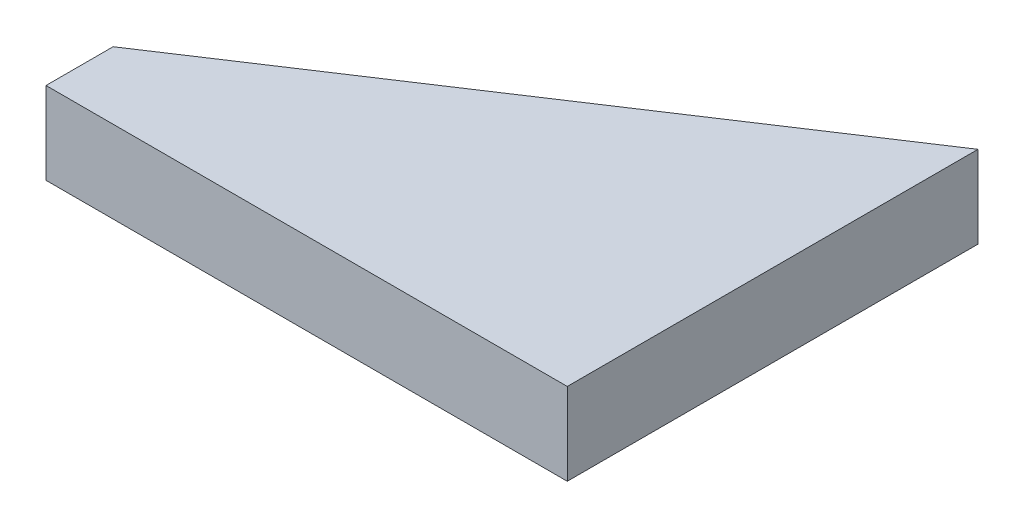
ISO-10303-21;
HEADER;
FILE_DESCRIPTION(('STEP AP214'),'2;1');
FILE_NAME('part.step','',(''),(''),'','','');
FILE_SCHEMA(('AUTOMOTIVE_DESIGN { 1 0 10303 214 1 1 1 1 }'));
ENDSEC;
DATA;
#1=APPLICATION_CONTEXT('core data for automotive mechanical design processes');
#2=APPLICATION_PROTOCOL_DEFINITION('international standard','automotive_design',2000,#1);
#3=PRODUCT_CONTEXT('',#1,'mechanical');
#4=PRODUCT('Part','Part','',(#3));
#5=PRODUCT_RELATED_PRODUCT_CATEGORY('part','',(#4));
#6=PRODUCT_DEFINITION_FORMATION('','',#4);
#7=PRODUCT_DEFINITION_CONTEXT('part definition',#1,'design');
#8=PRODUCT_DEFINITION('design','',#6,#7);
#9=PRODUCT_DEFINITION_SHAPE('','',#8);
#10=(LENGTH_UNIT() NAMED_UNIT(*) SI_UNIT(.MILLI.,.METRE.));
#11=(NAMED_UNIT(*) PLANE_ANGLE_UNIT() SI_UNIT($,.RADIAN.));
#12=(NAMED_UNIT(*) SI_UNIT($,.STERADIAN.) SOLID_ANGLE_UNIT());
#13=UNCERTAINTY_MEASURE_WITH_UNIT(LENGTH_MEASURE(1.E-05),#10,'distance_accuracy_value','');
#14=(GEOMETRIC_REPRESENTATION_CONTEXT(3) GLOBAL_UNCERTAINTY_ASSIGNED_CONTEXT((#13)) GLOBAL_UNIT_ASSIGNED_CONTEXT((#10,
#11,#12)) REPRESENTATION_CONTEXT('',''));
#15=CARTESIAN_POINT('',(0.,0.,0.));
#16=DIRECTION('',(0.,0.,1.));
#17=DIRECTION('',(1.,0.,0.));
#18=AXIS2_PLACEMENT_3D('',#15,#16,#17);
#19=CARTESIAN_POINT('',(75.8577859185393,10.,0.));
#20=DIRECTION('',(-1.,0.,0.));
#21=DIRECTION('',(0.,0.,1.));
#22=AXIS2_PLACEMENT_3D('',#19,#20,#21);
#23=PLANE('',#22);
#24=DIRECTION('',(0.,0.,-1.));
#25=VECTOR('',#24,1.);
#26=CARTESIAN_POINT('',(75.8577859185393,0.,0.));
#27=LINE('',#26,#25);
#28=CARTESIAN_POINT('',(75.8577859185393,0.,0.));
#29=VERTEX_POINT('',#28);
#30=CARTESIAN_POINT('',(75.8577859185393,0.,-50.));
#31=VERTEX_POINT('',#30);
#32=EDGE_CURVE('E532',#29,#31,#27,.T.);
#33=ORIENTED_EDGE('',*,*,#32,.T.);
#34=DIRECTION('',(0.,-1.,0.));
#35=VECTOR('',#34,1.);
#36=CARTESIAN_POINT('',(75.8577859185393,10.,-50.));
#37=LINE('',#36,#35);
#38=CARTESIAN_POINT('',(75.8577859185393,10.,-50.));
#39=VERTEX_POINT('',#38);
#40=EDGE_CURVE('E12',#39,#31,#37,.T.);
#41=ORIENTED_EDGE('',*,*,#40,.F.);
#42=DIRECTION('',(0.,0.,-1.));
#43=VECTOR('',#42,1.);
#44=CARTESIAN_POINT('',(75.8577859185393,10.,0.));
#45=LINE('',#44,#43);
#46=CARTESIAN_POINT('',(75.8577859185393,10.,0.));
#47=VERTEX_POINT('',#46);
#48=EDGE_CURVE('E520',#47,#39,#45,.T.);
#49=ORIENTED_EDGE('',*,*,#48,.F.);
#50=DIRECTION('',(0.,-1.,0.));
#51=VECTOR('',#50,1.);
#52=CARTESIAN_POINT('',(75.8577859185393,10.,0.));
#53=LINE('',#52,#51);
#54=EDGE_CURVE('E528',#47,#29,#53,.T.);
#55=ORIENTED_EDGE('',*,*,#54,.T.);
#56=EDGE_LOOP('',(#33,#41,#49,#55));
#57=FACE_BOUND('',#56,.T.);
#58=ADVANCED_FACE('F469',(#57),#23,.F.);
#59=CARTESIAN_POINT('',(75.8577859185393,10.,-50.));
#60=DIRECTION('',(0.550335023261757,0.,0.834943927561295));
#61=DIRECTION('',(0.834943927561295,0.,-0.550335023261757));
#62=AXIS2_PLACEMENT_3D('',#59,#60,#61);
#63=PLANE('',#62);
#64=DIRECTION('',(-0.834943927561295,0.,0.550335023261757));
#65=VECTOR('',#64,1.);
#66=CARTESIAN_POINT('',(75.8577859185393,0.,-50.));
#67=LINE('',#66,#65);
#68=CARTESIAN_POINT('',(12.4,0.,-8.17318871744812));
#69=VERTEX_POINT('',#68);
#70=EDGE_CURVE('E524',#31,#69,#67,.T.);
#71=ORIENTED_EDGE('',*,*,#70,.T.);
#72=DIRECTION('',(0.,-1.,0.));
#73=VECTOR('',#72,1.);
#74=CARTESIAN_POINT('',(12.4,10.,-8.17318871744812));
#75=LINE('',#74,#73);
#76=CARTESIAN_POINT('',(12.4,10.,-8.17318871744812));
#77=VERTEX_POINT('',#76);
#78=EDGE_CURVE('E477',#77,#69,#75,.T.);
#79=ORIENTED_EDGE('',*,*,#78,.F.);
#80=DIRECTION('',(-0.834943927561295,0.,0.550335023261757));
#81=VECTOR('',#80,1.);
#82=CARTESIAN_POINT('',(75.8577859185393,10.,-50.));
#83=LINE('',#82,#81);
#84=EDGE_CURVE('E515',#39,#77,#83,.T.);
#85=ORIENTED_EDGE('',*,*,#84,.F.);
#86=ORIENTED_EDGE('',*,*,#40,.T.);
#87=EDGE_LOOP('',(#71,#79,#85,#86));
#88=FACE_BOUND('',#87,.T.);
#89=ADVANCED_FACE('F523',(#88),#63,.F.);
#90=CARTESIAN_POINT('',(12.4,10.,0.));
#91=DIRECTION('',(1.,0.,0.));
#92=DIRECTION('',(0.,0.,-1.));
#93=AXIS2_PLACEMENT_3D('',#90,#91,#92);
#94=PLANE('',#93);
#95=DIRECTION('',(0.,0.,1.));
#96=VECTOR('',#95,1.);
#97=CARTESIAN_POINT('',(12.4,0.,0.));
#98=LINE('',#97,#96);
#99=CARTESIAN_POINT('',(12.4,0.,0.));
#100=VERTEX_POINT('',#99);
#101=EDGE_CURVE('E502',#69,#100,#98,.T.);
#102=ORIENTED_EDGE('',*,*,#101,.T.);
#103=DIRECTION('',(0.,-1.,0.));
#104=VECTOR('',#103,1.);
#105=CARTESIAN_POINT('',(12.4,10.,0.));
#106=LINE('',#105,#104);
#107=CARTESIAN_POINT('',(12.4,10.,0.));
#108=VERTEX_POINT('',#107);
#109=EDGE_CURVE('E525',#108,#100,#106,.T.);
#110=ORIENTED_EDGE('',*,*,#109,.F.);
#111=DIRECTION('',(0.,0.,1.));
#112=VECTOR('',#111,1.);
#113=CARTESIAN_POINT('',(12.4,10.,0.));
#114=LINE('',#113,#112);
#115=EDGE_CURVE('E518',#77,#108,#114,.T.);
#116=ORIENTED_EDGE('',*,*,#115,.F.);
#117=ORIENTED_EDGE('',*,*,#78,.T.);
#118=EDGE_LOOP('',(#102,#110,#116,#117));
#119=FACE_BOUND('',#118,.T.);
#120=ADVANCED_FACE('F526',(#119),#94,.F.);
#121=CARTESIAN_POINT('',(12.4,10.,0.));
#122=DIRECTION('',(0.,0.,-1.));
#123=DIRECTION('',(-1.,0.,0.));
#124=AXIS2_PLACEMENT_3D('',#121,#122,#123);
#125=PLANE('',#124);
#126=DIRECTION('',(1.,0.,0.));
#127=VECTOR('',#126,1.);
#128=CARTESIAN_POINT('',(12.4,0.,0.));
#129=LINE('',#128,#127);
#130=EDGE_CURVE('E508',#100,#29,#129,.T.);
#131=ORIENTED_EDGE('',*,*,#130,.T.);
#132=ORIENTED_EDGE('',*,*,#54,.F.);
#133=DIRECTION('',(1.,0.,0.));
#134=VECTOR('',#133,1.);
#135=CARTESIAN_POINT('',(12.4,10.,0.));
#136=LINE('',#135,#134);
#137=EDGE_CURVE('E485',#108,#47,#136,.T.);
#138=ORIENTED_EDGE('',*,*,#137,.F.);
#139=ORIENTED_EDGE('',*,*,#109,.T.);
#140=EDGE_LOOP('',(#131,#132,#138,#139));
#141=FACE_BOUND('',#140,.T.);
#142=ADVANCED_FACE('F539',(#141),#125,.F.);
#143=CARTESIAN_POINT('',(0.,10.,0.));
#144=DIRECTION('',(0.,-1.,0.));
#145=DIRECTION('',(0.,0.,-1.));
#146=AXIS2_PLACEMENT_3D('',#143,#144,#145);
#147=PLANE('',#146);
#148=ORIENTED_EDGE('',*,*,#48,.T.);
#149=ORIENTED_EDGE('',*,*,#84,.T.);
#150=ORIENTED_EDGE('',*,*,#115,.T.);
#151=ORIENTED_EDGE('',*,*,#137,.T.);
#152=EDGE_LOOP('',(#148,#149,#150,#151));
#153=FACE_BOUND('',#152,.T.);
#154=ADVANCED_FACE('F516',(#153),#147,.F.);
#155=CARTESIAN_POINT('',(0.,0.,0.));
#156=DIRECTION('',(0.,-1.,0.));
#157=DIRECTION('',(0.,0.,-1.));
#158=AXIS2_PLACEMENT_3D('',#155,#156,#157);
#159=PLANE('',#158);
#160=ORIENTED_EDGE('',*,*,#32,.F.);
#161=ORIENTED_EDGE('',*,*,#130,.F.);
#162=ORIENTED_EDGE('',*,*,#101,.F.);
#163=ORIENTED_EDGE('',*,*,#70,.F.);
#164=EDGE_LOOP('',(#160,#161,#162,#163));
#165=FACE_BOUND('',#164,.T.);
#166=ADVANCED_FACE('F542',(#165),#159,.T.);
#167=CLOSED_SHELL('',(#58,#89,#120,#142,#154,#166));
#168=MANIFOLD_SOLID_BREP('B2',#167);
#169=ADVANCED_BREP_SHAPE_REPRESENTATION('',(#18,#168),#14);
#170=SHAPE_DEFINITION_REPRESENTATION(#9,#169);
ENDSEC;
END-ISO-10303-21;
